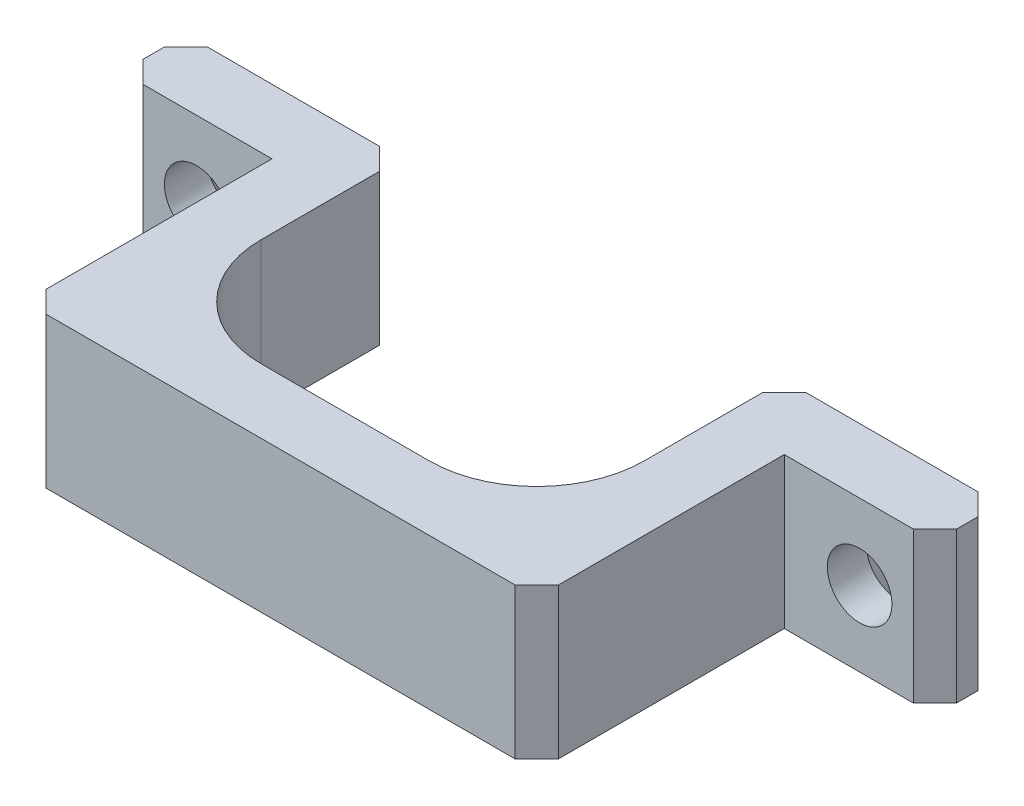
ISO-10303-21;
HEADER;
FILE_DESCRIPTION(('STEP AP214'),'2;1');
FILE_NAME('part.step','',(''),(''),'','','');
FILE_SCHEMA(('AUTOMOTIVE_DESIGN { 1 0 10303 214 1 1 1 1 }'));
ENDSEC;
DATA;
#1=APPLICATION_CONTEXT('core data for automotive mechanical design processes');
#2=APPLICATION_PROTOCOL_DEFINITION('international standard','automotive_design',2000,#1);
#3=PRODUCT_CONTEXT('',#1,'mechanical');
#4=PRODUCT('Part','Part','',(#3));
#5=PRODUCT_RELATED_PRODUCT_CATEGORY('part','',(#4));
#6=PRODUCT_DEFINITION_FORMATION('','',#4);
#7=PRODUCT_DEFINITION_CONTEXT('part definition',#1,'design');
#8=PRODUCT_DEFINITION('design','',#6,#7);
#9=PRODUCT_DEFINITION_SHAPE('','',#8);
#10=(LENGTH_UNIT() NAMED_UNIT(*) SI_UNIT(.MILLI.,.METRE.));
#11=(NAMED_UNIT(*) PLANE_ANGLE_UNIT() SI_UNIT($,.RADIAN.));
#12=(NAMED_UNIT(*) SI_UNIT($,.STERADIAN.) SOLID_ANGLE_UNIT());
#13=UNCERTAINTY_MEASURE_WITH_UNIT(LENGTH_MEASURE(1.E-05),#10,'distance_accuracy_value','');
#14=(GEOMETRIC_REPRESENTATION_CONTEXT(3) GLOBAL_UNCERTAINTY_ASSIGNED_CONTEXT((#13)) GLOBAL_UNIT_ASSIGNED_CONTEXT((#10,
#11,#12)) REPRESENTATION_CONTEXT('',''));
#15=CARTESIAN_POINT('',(0.,0.,0.));
#16=DIRECTION('',(0.,0.,1.));
#17=DIRECTION('',(1.,0.,0.));
#18=AXIS2_PLACEMENT_3D('',#15,#16,#17);
#19=CARTESIAN_POINT('',(-15.4,-7.,3.));
#20=DIRECTION('',(0.,0.,-1.));
#21=DIRECTION('',(-1.,0.,0.));
#22=AXIS2_PLACEMENT_3D('',#19,#20,#21);
#23=PLANE('',#22);
#24=CARTESIAN_POINT('',(15.4,-3.52108829518854,3.));
#25=DIRECTION('',(0.,0.,-1.));
#26=DIRECTION('',(-1.,0.,0.));
#27=AXIS2_PLACEMENT_3D('',#24,#25,#26);
#28=CIRCLE('',#27,1.49999999999999);
#29=CARTESIAN_POINT('',(13.9,-3.52108829518854,3.));
#30=VERTEX_POINT('',#29);
#31=EDGE_CURVE('E666',#30,#30,#28,.T.);
#32=ORIENTED_EDGE('',*,*,#31,.T.);
#33=EDGE_LOOP('',(#32));
#34=FACE_BOUND('',#33,.T.);
#35=DIRECTION('',(1.,0.,0.));
#36=VECTOR('',#35,1.);
#37=CARTESIAN_POINT('',(0.,-7.,3.));
#38=LINE('',#37,#36);
#39=CARTESIAN_POINT('',(11.9,-7.,3.));
#40=VERTEX_POINT('',#39);
#41=CARTESIAN_POINT('',(17.9,-7.,3.));
#42=VERTEX_POINT('',#41);
#43=EDGE_CURVE('E231',#40,#42,#38,.T.);
#44=ORIENTED_EDGE('',*,*,#43,.T.);
#45=DIRECTION('',(0.,1.,0.));
#46=VECTOR('',#45,1.);
#47=CARTESIAN_POINT('',(17.9,-7.,3.));
#48=LINE('',#47,#46);
#49=CARTESIAN_POINT('',(17.9,0.,3.));
#50=VERTEX_POINT('',#49);
#51=EDGE_CURVE('E251',#42,#50,#48,.T.);
#52=ORIENTED_EDGE('',*,*,#51,.T.);
#53=DIRECTION('',(-1.,0.,0.));
#54=VECTOR('',#53,1.);
#55=CARTESIAN_POINT('',(-15.4,0.,3.));
#56=LINE('',#55,#54);
#57=CARTESIAN_POINT('',(11.9,0.,3.));
#58=VERTEX_POINT('',#57);
#59=EDGE_CURVE('E360',#50,#58,#56,.T.);
#60=ORIENTED_EDGE('',*,*,#59,.T.);
#61=DIRECTION('',(0.,1.,0.));
#62=VECTOR('',#61,1.);
#63=CARTESIAN_POINT('',(11.9,0.,3.));
#64=LINE('',#63,#62);
#65=EDGE_CURVE('E594',#40,#58,#64,.T.);
#66=ORIENTED_EDGE('',*,*,#65,.F.);
#67=EDGE_LOOP('',(#44,#52,#60,#66));
#68=FACE_BOUND('',#67,.T.);
#69=ADVANCED_FACE('F61',(#34,#68),#23,.F.);
#70=CARTESIAN_POINT('',(-15.4,-3.52108829518854,3.));
#71=DIRECTION('',(0.,0.,1.));
#72=DIRECTION('',(1.,0.,0.));
#73=AXIS2_PLACEMENT_3D('',#70,#71,#72);
#74=CIRCLE('',#73,1.49999999999999);
#75=CARTESIAN_POINT('',(-13.9,-3.52108829518854,3.));
#76=VERTEX_POINT('',#75);
#77=EDGE_CURVE('E673',#76,#76,#74,.T.);
#78=ORIENTED_EDGE('',*,*,#77,.F.);
#79=EDGE_LOOP('',(#78));
#80=FACE_BOUND('',#79,.T.);
#81=CARTESIAN_POINT('',(-17.9,-7.,3.));
#82=VERTEX_POINT('',#81);
#83=CARTESIAN_POINT('',(-11.9,-7.,3.));
#84=VERTEX_POINT('',#83);
#85=EDGE_CURVE('E220',#82,#84,#38,.T.);
#86=ORIENTED_EDGE('',*,*,#85,.T.);
#87=DIRECTION('',(0.,-1.,0.));
#88=VECTOR('',#87,1.);
#89=CARTESIAN_POINT('',(-11.9,-7.,3.));
#90=LINE('',#89,#88);
#91=CARTESIAN_POINT('',(-11.9,0.,3.));
#92=VERTEX_POINT('',#91);
#93=EDGE_CURVE('E687',#92,#84,#90,.T.);
#94=ORIENTED_EDGE('',*,*,#93,.F.);
#95=CARTESIAN_POINT('',(-17.9,0.,3.));
#96=VERTEX_POINT('',#95);
#97=EDGE_CURVE('E248',#92,#96,#56,.T.);
#98=ORIENTED_EDGE('',*,*,#97,.T.);
#99=DIRECTION('',(0.,-1.,0.));
#100=VECTOR('',#99,1.);
#101=CARTESIAN_POINT('',(-17.9,-7.,3.));
#102=LINE('',#101,#100);
#103=EDGE_CURVE('E238',#96,#82,#102,.T.);
#104=ORIENTED_EDGE('',*,*,#103,.T.);
#105=EDGE_LOOP('',(#86,#94,#98,#104));
#106=FACE_BOUND('',#105,.T.);
#107=ADVANCED_FACE('F246',(#80,#106),#23,.F.);
#108=CARTESIAN_POINT('',(13.9,-7.,0.));
#109=DIRECTION('',(0.,0.,1.));
#110=DIRECTION('',(1.,0.,0.));
#111=AXIS2_PLACEMENT_3D('',#108,#109,#110);
#112=PLANE('',#111);
#113=DIRECTION('',(1.,0.,0.));
#114=VECTOR('',#113,1.);
#115=CARTESIAN_POINT('',(13.9,-7.,0.));
#116=LINE('',#115,#114);
#117=CARTESIAN_POINT('',(-17.9,-7.,0.));
#118=VERTEX_POINT('',#117);
#119=CARTESIAN_POINT('',(-9.9,-7.,0.));
#120=VERTEX_POINT('',#119);
#121=EDGE_CURVE('E243',#118,#120,#116,.T.);
#122=ORIENTED_EDGE('',*,*,#121,.F.);
#123=DIRECTION('',(0.,1.,0.));
#124=VECTOR('',#123,1.);
#125=CARTESIAN_POINT('',(-17.9,0.,0.));
#126=LINE('',#125,#124);
#127=CARTESIAN_POINT('',(-17.9,-4.51885450189423,0.));
#128=VERTEX_POINT('',#127);
#129=EDGE_CURVE('E259',#118,#128,#126,.T.);
#130=ORIENTED_EDGE('',*,*,#129,.T.);
#131=CARTESIAN_POINT('',(-15.4,-3.52108829518854,0.));
#132=DIRECTION('',(0.,0.,1.));
#133=DIRECTION('',(1.,0.,0.));
#134=AXIS2_PLACEMENT_3D('',#131,#132,#133);
#135=CIRCLE('',#134,2.69175359259421);
#136=CARTESIAN_POINT('',(-17.9,-2.52332208848286,0.));
#137=VERTEX_POINT('',#136);
#138=EDGE_CURVE('E476',#128,#137,#135,.T.);
#139=ORIENTED_EDGE('',*,*,#138,.T.);
#140=CARTESIAN_POINT('',(-17.9,0.,0.));
#141=VERTEX_POINT('',#140);
#142=EDGE_CURVE('E430',#137,#141,#126,.T.);
#143=ORIENTED_EDGE('',*,*,#142,.T.);
#144=DIRECTION('',(1.,0.,0.));
#145=VECTOR('',#144,1.);
#146=CARTESIAN_POINT('',(13.9,0.,0.));
#147=LINE('',#146,#145);
#148=CARTESIAN_POINT('',(-9.9,0.,0.));
#149=VERTEX_POINT('',#148);
#150=EDGE_CURVE('E351',#141,#149,#147,.T.);
#151=ORIENTED_EDGE('',*,*,#150,.T.);
#152=DIRECTION('',(0.,-1.,0.));
#153=VECTOR('',#152,1.);
#154=CARTESIAN_POINT('',(-9.9,-7.,0.));
#155=LINE('',#154,#153);
#156=EDGE_CURVE('E573',#149,#120,#155,.T.);
#157=ORIENTED_EDGE('',*,*,#156,.T.);
#158=EDGE_LOOP('',(#122,#130,#139,#143,#151,#157));
#159=FACE_BOUND('',#158,.T.);
#160=ADVANCED_FACE('F530',(#159),#112,.F.);
#161=CARTESIAN_POINT('',(9.9,-7.,0.));
#162=VERTEX_POINT('',#161);
#163=CARTESIAN_POINT('',(17.9,-7.,0.));
#164=VERTEX_POINT('',#163);
#165=EDGE_CURVE('E578',#162,#164,#116,.T.);
#166=ORIENTED_EDGE('',*,*,#165,.F.);
#167=DIRECTION('',(0.,1.,0.));
#168=VECTOR('',#167,1.);
#169=CARTESIAN_POINT('',(9.9,-7.,0.));
#170=LINE('',#169,#168);
#171=CARTESIAN_POINT('',(9.9,0.,0.));
#172=VERTEX_POINT('',#171);
#173=EDGE_CURVE('E636',#162,#172,#170,.T.);
#174=ORIENTED_EDGE('',*,*,#173,.T.);
#175=CARTESIAN_POINT('',(17.9,0.,0.));
#176=VERTEX_POINT('',#175);
#177=EDGE_CURVE('E357',#172,#176,#147,.T.);
#178=ORIENTED_EDGE('',*,*,#177,.T.);
#179=DIRECTION('',(0.,-1.,0.));
#180=VECTOR('',#179,1.);
#181=CARTESIAN_POINT('',(17.9,-7.,0.));
#182=LINE('',#181,#180);
#183=CARTESIAN_POINT('',(17.9,-3.52108829518854,0.));
#184=VERTEX_POINT('',#183);
#185=EDGE_CURVE('E366',#176,#184,#182,.T.);
#186=ORIENTED_EDGE('',*,*,#185,.T.);
#187=CARTESIAN_POINT('',(15.4,-3.52108829518854,0.));
#188=DIRECTION('',(0.,0.,1.));
#189=DIRECTION('',(1.,0.,0.));
#190=AXIS2_PLACEMENT_3D('',#187,#188,#189);
#191=CIRCLE('',#190,2.5);
#192=EDGE_CURVE('E472',#184,#184,#191,.T.);
#193=ORIENTED_EDGE('',*,*,#192,.T.);
#194=EDGE_CURVE('E365',#184,#164,#182,.T.);
#195=ORIENTED_EDGE('',*,*,#194,.T.);
#196=EDGE_LOOP('',(#166,#174,#178,#186,#193,#195));
#197=FACE_BOUND('',#196,.T.);
#198=ADVANCED_FACE('F539',(#197),#112,.F.);
#199=CARTESIAN_POINT('',(18.9,-7.,1.));
#200=DIRECTION('',(0.707106781186547,0.,-0.707106781186548));
#201=DIRECTION('',(0.,-1.,0.));
#202=AXIS2_PLACEMENT_3D('',#199,#200,#201);
#203=PLANE('',#202);
#204=DIRECTION('',(0.,-1.,0.));
#205=VECTOR('',#204,1.);
#206=CARTESIAN_POINT('',(18.9,-7.,1.));
#207=LINE('',#206,#205);
#208=CARTESIAN_POINT('',(18.9,0.,1.));
#209=VERTEX_POINT('',#208);
#210=CARTESIAN_POINT('',(18.9,-7.,1.));
#211=VERTEX_POINT('',#210);
#212=EDGE_CURVE('E464',#209,#211,#207,.T.);
#213=ORIENTED_EDGE('',*,*,#212,.T.);
#214=DIRECTION('',(-0.707106781186548,0.,-0.707106781186547));
#215=VECTOR('',#214,1.);
#216=CARTESIAN_POINT('',(18.9,-7.,1.));
#217=LINE('',#216,#215);
#218=EDGE_CURVE('E77',#211,#164,#217,.T.);
#219=ORIENTED_EDGE('',*,*,#218,.T.);
#220=ORIENTED_EDGE('',*,*,#194,.F.);
#221=ORIENTED_EDGE('',*,*,#185,.F.);
#222=DIRECTION('',(-0.707106781186548,0.,-0.707106781186547));
#223=VECTOR('',#222,1.);
#224=CARTESIAN_POINT('',(18.9,0.,1.));
#225=LINE('',#224,#223);
#226=EDGE_CURVE('E431',#209,#176,#225,.T.);
#227=ORIENTED_EDGE('',*,*,#226,.F.);
#228=EDGE_LOOP('',(#213,#219,#220,#221,#227));
#229=FACE_BOUND('',#228,.T.);
#230=ADVANCED_FACE('F542',(#229),#203,.T.);
#231=CARTESIAN_POINT('',(17.9,-7.,3.));
#232=DIRECTION('',(-0.707106781186547,0.,-0.707106781186548));
#233=DIRECTION('',(0.,1.,0.));
#234=AXIS2_PLACEMENT_3D('',#231,#232,#233);
#235=PLANE('',#234);
#236=ORIENTED_EDGE('',*,*,#51,.F.);
#237=DIRECTION('',(-0.707106781186548,0.,0.707106781186547));
#238=VECTOR('',#237,1.);
#239=CARTESIAN_POINT('',(17.9,-7.,3.));
#240=LINE('',#239,#238);
#241=CARTESIAN_POINT('',(18.9,-7.,2.00000000000001));
#242=VERTEX_POINT('',#241);
#243=EDGE_CURVE('E242',#42,#242,#240,.F.);
#244=ORIENTED_EDGE('',*,*,#243,.T.);
#245=DIRECTION('',(0.,-1.,0.));
#246=VECTOR('',#245,1.);
#247=CARTESIAN_POINT('',(18.9,-7.,2.));
#248=LINE('',#247,#246);
#249=CARTESIAN_POINT('',(18.9,0.,2.));
#250=VERTEX_POINT('',#249);
#251=EDGE_CURVE('E459',#242,#250,#248,.F.);
#252=ORIENTED_EDGE('',*,*,#251,.T.);
#253=DIRECTION('',(-0.707106781186548,0.,0.707106781186547));
#254=VECTOR('',#253,1.);
#255=CARTESIAN_POINT('',(17.9,0.,3.));
#256=LINE('',#255,#254);
#257=EDGE_CURVE('E435',#50,#250,#256,.F.);
#258=ORIENTED_EDGE('',*,*,#257,.F.);
#259=EDGE_LOOP('',(#236,#244,#252,#258));
#260=FACE_BOUND('',#259,.T.);
#261=ADVANCED_FACE('F548',(#260),#235,.F.);
#262=CARTESIAN_POINT('',(-18.9,-7.,2.));
#263=DIRECTION('',(-0.707106781186546,0.,0.707106781186549));
#264=DIRECTION('',(0.,-1.,0.));
#265=AXIS2_PLACEMENT_3D('',#262,#263,#264);
#266=PLANE('',#265);
#267=DIRECTION('',(0.,-1.,0.));
#268=VECTOR('',#267,1.);
#269=CARTESIAN_POINT('',(-18.9,-7.,2.));
#270=LINE('',#269,#268);
#271=CARTESIAN_POINT('',(-18.9,0.,2.));
#272=VERTEX_POINT('',#271);
#273=CARTESIAN_POINT('',(-18.9,-7.,2.));
#274=VERTEX_POINT('',#273);
#275=EDGE_CURVE('E240',#272,#274,#270,.T.);
#276=ORIENTED_EDGE('',*,*,#275,.T.);
#277=DIRECTION('',(0.707106781186549,0.,0.707106781186546));
#278=VECTOR('',#277,1.);
#279=CARTESIAN_POINT('',(-18.9,-7.,2.));
#280=LINE('',#279,#278);
#281=EDGE_CURVE('E84',#274,#82,#280,.T.);
#282=ORIENTED_EDGE('',*,*,#281,.T.);
#283=ORIENTED_EDGE('',*,*,#103,.F.);
#284=DIRECTION('',(0.707106781186549,0.,0.707106781186546));
#285=VECTOR('',#284,1.);
#286=CARTESIAN_POINT('',(-18.9,0.,2.));
#287=LINE('',#286,#285);
#288=EDGE_CURVE('E438',#272,#96,#287,.T.);
#289=ORIENTED_EDGE('',*,*,#288,.F.);
#290=EDGE_LOOP('',(#276,#282,#283,#289));
#291=FACE_BOUND('',#290,.T.);
#292=ADVANCED_FACE('F236',(#291),#266,.T.);
#293=CARTESIAN_POINT('',(-17.9,-7.,0.));
#294=DIRECTION('',(-0.707106781186547,0.,-0.707106781186548));
#295=DIRECTION('',(0.,-1.,0.));
#296=AXIS2_PLACEMENT_3D('',#293,#294,#295);
#297=PLANE('',#296);
#298=ORIENTED_EDGE('',*,*,#129,.F.);
#299=DIRECTION('',(-0.707106781186548,0.,0.707106781186547));
#300=VECTOR('',#299,1.);
#301=CARTESIAN_POINT('',(-17.9,-7.,0.));
#302=LINE('',#301,#300);
#303=CARTESIAN_POINT('',(-18.9,-7.,0.999999999999992));
#304=VERTEX_POINT('',#303);
#305=EDGE_CURVE('E568',#118,#304,#302,.T.);
#306=ORIENTED_EDGE('',*,*,#305,.T.);
#307=DIRECTION('',(0.,1.,0.));
#308=VECTOR('',#307,1.);
#309=CARTESIAN_POINT('',(-18.9,-7.,0.999999999999992));
#310=LINE('',#309,#308);
#311=CARTESIAN_POINT('',(-18.9,0.,0.999999999999992));
#312=VERTEX_POINT('',#311);
#313=EDGE_CURVE('E456',#304,#312,#310,.T.);
#314=ORIENTED_EDGE('',*,*,#313,.T.);
#315=DIRECTION('',(-0.707106781186548,0.,0.707106781186547));
#316=VECTOR('',#315,1.);
#317=CARTESIAN_POINT('',(-17.9,0.,0.));
#318=LINE('',#317,#316);
#319=EDGE_CURVE('E371',#141,#312,#318,.T.);
#320=ORIENTED_EDGE('',*,*,#319,.F.);
#321=ORIENTED_EDGE('',*,*,#142,.F.);
#322=CARTESIAN_POINT('',(-17.9,-2.52332208848286,0.));
#323=CARTESIAN_POINT('',(-17.9101389096454,-2.58131880890307,0.0101389096453853));
#324=CARTESIAN_POINT('',(-17.9194527261863,-2.6395990363849,0.0194527261863021));
#325=CARTESIAN_POINT('',(-17.9363654759192,-2.75666181262716,0.0363654759192318));
#326=CARTESIAN_POINT('',(-17.9439642024387,-2.81544442104088,0.0439642024386729));
#327=CARTESIAN_POINT('',(-17.9640916375543,-2.99246582745685,0.064091637554281));
#328=CARTESIAN_POINT('',(-17.9739449596483,-3.11134060912433,0.0739449596483276));
#329=CARTESIAN_POINT('',(-17.9860297052182,-3.34737295212778,0.0860297052182067));
#330=CARTESIAN_POINT('',(-17.9884149231967,-3.46451501508551,0.0884149231967267));
#331=CARTESIAN_POINT('',(-17.9859178784112,-3.69857870371176,0.0859178784111792));
#332=CARTESIAN_POINT('',(-17.9810402010261,-3.81550042184029,0.0810402010261443));
#333=CARTESIAN_POINT('',(-17.965494598829,-4.03033558949788,0.0654945988290064));
#334=CARTESIAN_POINT('',(-17.9558357107894,-4.12839952170905,0.0558357107893599));
#335=CARTESIAN_POINT('',(-17.931588665761,-4.3242105462924,0.0315886657610437));
#336=CARTESIAN_POINT('',(-17.9169571093415,-4.42194692329425,0.0169571093415447));
#337=CARTESIAN_POINT('',(-17.9,-4.51885450189423,0.));
#338=B_SPLINE_CURVE_WITH_KNOTS('',3,(#322,#323,#324,#325,#326,#327,#328,#329,#330,#331,#332,
#333,#334,#335,#336,#337),.UNSPECIFIED.,.F.,.F.,(4,2,2,2,2,2,2,4),(0.,0.179205192813009,
0.358431968777682,0.717001407619334,1.06813636774897,1.41904973521207,1.7158425940141,
2.01529525423668),.UNSPECIFIED.);
#339=EDGE_CURVE('E480',#137,#128,#338,.T.);
#340=ORIENTED_EDGE('',*,*,#339,.T.);
#341=EDGE_LOOP('',(#298,#306,#314,#320,#321,#340));
#342=FACE_BOUND('',#341,.T.);
#343=ADVANCED_FACE('F493',(#342),#297,.T.);
#344=CARTESIAN_POINT('',(18.9,-7.,1.));
#345=DIRECTION('',(1.,0.,0.));
#346=DIRECTION('',(0.,1.,0.));
#347=AXIS2_PLACEMENT_3D('',#344,#345,#346);
#348=PLANE('',#347);
#349=ORIENTED_EDGE('',*,*,#251,.F.);
#350=DIRECTION('',(0.,0.,1.));
#351=VECTOR('',#350,1.);
#352=CARTESIAN_POINT('',(18.9,-7.,-7.));
#353=LINE('',#352,#351);
#354=EDGE_CURVE('E230',#211,#242,#353,.T.);
#355=ORIENTED_EDGE('',*,*,#354,.F.);
#356=ORIENTED_EDGE('',*,*,#212,.F.);
#357=DIRECTION('',(0.,0.,-1.));
#358=VECTOR('',#357,1.);
#359=CARTESIAN_POINT('',(18.9,0.,1.));
#360=LINE('',#359,#358);
#361=EDGE_CURVE('E458',#250,#209,#360,.T.);
#362=ORIENTED_EDGE('',*,*,#361,.F.);
#363=EDGE_LOOP('',(#349,#355,#356,#362));
#364=FACE_BOUND('',#363,.T.);
#365=ADVANCED_FACE('F561',(#364),#348,.T.);
#366=CARTESIAN_POINT('',(-18.9,-7.,2.));
#367=DIRECTION('',(1.,0.,0.));
#368=DIRECTION('',(0.,-1.,0.));
#369=AXIS2_PLACEMENT_3D('',#366,#367,#368);
#370=PLANE('',#369);
#371=ORIENTED_EDGE('',*,*,#313,.F.);
#372=DIRECTION('',(0.,0.,-1.));
#373=VECTOR('',#372,1.);
#374=CARTESIAN_POINT('',(-18.9,-7.,2.));
#375=LINE('',#374,#373);
#376=EDGE_CURVE('E12',#304,#274,#375,.F.);
#377=ORIENTED_EDGE('',*,*,#376,.T.);
#378=ORIENTED_EDGE('',*,*,#275,.F.);
#379=DIRECTION('',(0.,0.,-1.));
#380=VECTOR('',#379,1.);
#381=CARTESIAN_POINT('',(-18.9,0.,2.));
#382=LINE('',#381,#380);
#383=EDGE_CURVE('E450',#312,#272,#382,.F.);
#384=ORIENTED_EDGE('',*,*,#383,.F.);
#385=EDGE_LOOP('',(#371,#377,#378,#384));
#386=FACE_BOUND('',#385,.T.);
#387=ADVANCED_FACE('F455',(#386),#370,.F.);
#388=CARTESIAN_POINT('',(0.,0.,7.25));
#389=DIRECTION('',(0.,-1.,0.));
#390=DIRECTION('',(1.,0.,0.));
#391=AXIS2_PLACEMENT_3D('',#388,#389,#390);
#392=PLANE('',#391);
#393=ORIENTED_EDGE('',*,*,#257,.T.);
#394=ORIENTED_EDGE('',*,*,#361,.T.);
#395=ORIENTED_EDGE('',*,*,#226,.T.);
#396=ORIENTED_EDGE('',*,*,#177,.F.);
#397=DIRECTION('',(0.707106781186547,0.,-0.707106781186549));
#398=VECTOR('',#397,1.);
#399=CARTESIAN_POINT('',(9.9,0.,0.));
#400=LINE('',#399,#398);
#401=CARTESIAN_POINT('',(8.9,0.,1.00000000000001));
#402=VERTEX_POINT('',#401);
#403=EDGE_CURVE('E649',#172,#402,#400,.F.);
#404=ORIENTED_EDGE('',*,*,#403,.T.);
#405=DIRECTION('',(0.,0.,-1.));
#406=VECTOR('',#405,1.);
#407=CARTESIAN_POINT('',(8.9,0.,11.5));
#408=LINE('',#407,#406);
#409=CARTESIAN_POINT('',(8.9,0.,6.5));
#410=VERTEX_POINT('',#409);
#411=EDGE_CURVE('E671',#410,#402,#408,.T.);
#412=ORIENTED_EDGE('',*,*,#411,.F.);
#413=CARTESIAN_POINT('',(3.9,0.,6.5));
#414=DIRECTION('',(0.,-1.,0.));
#415=DIRECTION('',(0.,0.,-1.));
#416=AXIS2_PLACEMENT_3D('',#413,#414,#415);
#417=CIRCLE('',#416,5.);
#418=CARTESIAN_POINT('',(3.9,0.,11.5));
#419=VERTEX_POINT('',#418);
#420=EDGE_CURVE('E1132',#410,#419,#417,.T.);
#421=ORIENTED_EDGE('',*,*,#420,.T.);
#422=DIRECTION('',(1.,0.,0.));
#423=VECTOR('',#422,1.);
#424=CARTESIAN_POINT('',(-8.9,0.,11.5));
#425=LINE('',#424,#423);
#426=CARTESIAN_POINT('',(-3.9,0.,11.5));
#427=VERTEX_POINT('',#426);
#428=EDGE_CURVE('E665',#427,#419,#425,.T.);
#429=ORIENTED_EDGE('',*,*,#428,.F.);
#430=CARTESIAN_POINT('',(-3.9,0.,6.5));
#431=DIRECTION('',(0.,-1.,0.));
#432=DIRECTION('',(0.,0.,-1.));
#433=AXIS2_PLACEMENT_3D('',#430,#431,#432);
#434=CIRCLE('',#433,5.);
#435=CARTESIAN_POINT('',(-8.9,0.,6.5));
#436=VERTEX_POINT('',#435);
#437=EDGE_CURVE('E663',#427,#436,#434,.T.);
#438=ORIENTED_EDGE('',*,*,#437,.T.);
#439=DIRECTION('',(0.,0.,1.));
#440=VECTOR('',#439,1.);
#441=CARTESIAN_POINT('',(-8.9,0.,0.));
#442=LINE('',#441,#440);
#443=CARTESIAN_POINT('',(-8.9,0.,0.999999999999998));
#444=VERTEX_POINT('',#443);
#445=EDGE_CURVE('E659',#444,#436,#442,.T.);
#446=ORIENTED_EDGE('',*,*,#445,.F.);
#447=DIRECTION('',(0.707106781186551,0.,0.707106781186544));
#448=VECTOR('',#447,1.);
#449=CARTESIAN_POINT('',(-8.9,0.,0.999999999999998));
#450=LINE('',#449,#448);
#451=EDGE_CURVE('E640',#444,#149,#450,.F.);
#452=ORIENTED_EDGE('',*,*,#451,.T.);
#453=ORIENTED_EDGE('',*,*,#150,.F.);
#454=ORIENTED_EDGE('',*,*,#319,.T.);
#455=ORIENTED_EDGE('',*,*,#383,.T.);
#456=ORIENTED_EDGE('',*,*,#288,.T.);
#457=ORIENTED_EDGE('',*,*,#97,.F.);
#458=DIRECTION('',(0.,0.,-1.));
#459=VECTOR('',#458,1.);
#460=CARTESIAN_POINT('',(-11.9,0.,14.5));
#461=LINE('',#460,#459);
#462=CARTESIAN_POINT('',(-11.9,0.,13.5));
#463=VERTEX_POINT('',#462);
#464=EDGE_CURVE('E699',#463,#92,#461,.T.);
#465=ORIENTED_EDGE('',*,*,#464,.F.);
#466=DIRECTION('',(-0.707106781186546,0.,-0.707106781186549));
#467=VECTOR('',#466,1.);
#468=CARTESIAN_POINT('',(-10.9,0.,14.5));
#469=LINE('',#468,#467);
#470=CARTESIAN_POINT('',(-10.9,0.,14.5));
#471=VERTEX_POINT('',#470);
#472=EDGE_CURVE('E646',#463,#471,#469,.F.);
#473=ORIENTED_EDGE('',*,*,#472,.T.);
#474=DIRECTION('',(-1.,0.,0.));
#475=VECTOR('',#474,1.);
#476=CARTESIAN_POINT('',(-11.9,0.,14.5));
#477=LINE('',#476,#475);
#478=CARTESIAN_POINT('',(10.9,0.,14.5));
#479=VERTEX_POINT('',#478);
#480=EDGE_CURVE('E682',#479,#471,#477,.T.);
#481=ORIENTED_EDGE('',*,*,#480,.F.);
#482=DIRECTION('',(-0.707106781186546,0.,0.707106781186549));
#483=VECTOR('',#482,1.);
#484=CARTESIAN_POINT('',(10.9,0.,14.5));
#485=LINE('',#484,#483);
#486=CARTESIAN_POINT('',(11.9,0.,13.5));
#487=VERTEX_POINT('',#486);
#488=EDGE_CURVE('E643',#479,#487,#485,.F.);
#489=ORIENTED_EDGE('',*,*,#488,.T.);
#490=DIRECTION('',(0.,0.,-1.));
#491=VECTOR('',#490,1.);
#492=CARTESIAN_POINT('',(11.9,0.,14.5));
#493=LINE('',#492,#491);
#494=EDGE_CURVE('E358',#487,#58,#493,.T.);
#495=ORIENTED_EDGE('',*,*,#494,.T.);
#496=ORIENTED_EDGE('',*,*,#59,.F.);
#497=EDGE_LOOP('',(#393,#394,#395,#396,#404,#412,#421,#429,#438,#446,#452,#453,#454,#455,#456,
#457,#465,#473,#481,#489,#495,#496));
#498=FACE_BOUND('',#497,.T.);
#499=ADVANCED_FACE('F449',(#498),#392,.F.);
#500=CARTESIAN_POINT('',(11.9,0.,14.5));
#501=DIRECTION('',(-1.,0.,0.));
#502=DIRECTION('',(0.,0.,1.));
#503=AXIS2_PLACEMENT_3D('',#500,#501,#502);
#504=PLANE('',#503);
#505=ORIENTED_EDGE('',*,*,#494,.F.);
#506=DIRECTION('',(0.,-1.,0.));
#507=VECTOR('',#506,1.);
#508=CARTESIAN_POINT('',(11.9,0.,13.5));
#509=LINE('',#508,#507);
#510=CARTESIAN_POINT('',(11.9,-7.,13.5));
#511=VERTEX_POINT('',#510);
#512=EDGE_CURVE('E623',#487,#511,#509,.T.);
#513=ORIENTED_EDGE('',*,*,#512,.T.);
#514=DIRECTION('',(0.,0.,-1.));
#515=VECTOR('',#514,1.);
#516=CARTESIAN_POINT('',(11.9,-7.,14.5));
#517=LINE('',#516,#515);
#518=EDGE_CURVE('E691',#511,#40,#517,.T.);
#519=ORIENTED_EDGE('',*,*,#518,.T.);
#520=ORIENTED_EDGE('',*,*,#65,.T.);
#521=EDGE_LOOP('',(#505,#513,#519,#520));
#522=FACE_BOUND('',#521,.T.);
#523=ADVANCED_FACE('F743',(#522),#504,.F.);
#524=CARTESIAN_POINT('',(-11.9,-7.,14.5));
#525=DIRECTION('',(1.,0.,0.));
#526=DIRECTION('',(0.,0.,-1.));
#527=AXIS2_PLACEMENT_3D('',#524,#525,#526);
#528=PLANE('',#527);
#529=DIRECTION('',(0.,0.,-1.));
#530=VECTOR('',#529,1.);
#531=CARTESIAN_POINT('',(-11.9,-7.,14.5));
#532=LINE('',#531,#530);
#533=CARTESIAN_POINT('',(-11.9,-7.,13.5));
#534=VERTEX_POINT('',#533);
#535=EDGE_CURVE('E224',#534,#84,#532,.T.);
#536=ORIENTED_EDGE('',*,*,#535,.F.);
#537=DIRECTION('',(0.,1.,0.));
#538=VECTOR('',#537,1.);
#539=CARTESIAN_POINT('',(-11.9,-7.,13.5));
#540=LINE('',#539,#538);
#541=EDGE_CURVE('E614',#534,#463,#540,.T.);
#542=ORIENTED_EDGE('',*,*,#541,.T.);
#543=ORIENTED_EDGE('',*,*,#464,.T.);
#544=ORIENTED_EDGE('',*,*,#93,.T.);
#545=EDGE_LOOP('',(#536,#542,#543,#544));
#546=FACE_BOUND('',#545,.T.);
#547=ADVANCED_FACE('F759',(#546),#528,.F.);
#548=CARTESIAN_POINT('',(11.9,-7.,14.5));
#549=DIRECTION('',(0.,1.,0.));
#550=DIRECTION('',(0.,0.,1.));
#551=AXIS2_PLACEMENT_3D('',#548,#549,#550);
#552=PLANE('',#551);
#553=ORIENTED_EDGE('',*,*,#518,.F.);
#554=DIRECTION('',(0.707106781186546,0.,-0.707106781186549));
#555=VECTOR('',#554,1.);
#556=CARTESIAN_POINT('',(10.9,-7.,14.5));
#557=LINE('',#556,#555);
#558=CARTESIAN_POINT('',(10.9,-7.,14.5));
#559=VERTEX_POINT('',#558);
#560=EDGE_CURVE('E617',#511,#559,#557,.F.);
#561=ORIENTED_EDGE('',*,*,#560,.T.);
#562=DIRECTION('',(1.,0.,0.));
#563=VECTOR('',#562,1.);
#564=CARTESIAN_POINT('',(11.9,-7.,14.5));
#565=LINE('',#564,#563);
#566=CARTESIAN_POINT('',(-10.9,-7.,14.5));
#567=VERTEX_POINT('',#566);
#568=EDGE_CURVE('E686',#567,#559,#565,.T.);
#569=ORIENTED_EDGE('',*,*,#568,.F.);
#570=DIRECTION('',(0.707106781186546,0.,0.707106781186549));
#571=VECTOR('',#570,1.);
#572=CARTESIAN_POINT('',(-10.9,-7.,14.5));
#573=LINE('',#572,#571);
#574=EDGE_CURVE('E620',#567,#534,#573,.F.);
#575=ORIENTED_EDGE('',*,*,#574,.T.);
#576=ORIENTED_EDGE('',*,*,#535,.T.);
#577=ORIENTED_EDGE('',*,*,#85,.F.);
#578=ORIENTED_EDGE('',*,*,#281,.F.);
#579=ORIENTED_EDGE('',*,*,#376,.F.);
#580=ORIENTED_EDGE('',*,*,#305,.F.);
#581=ORIENTED_EDGE('',*,*,#121,.T.);
#582=DIRECTION('',(-0.707106781186551,0.,-0.707106781186544));
#583=VECTOR('',#582,1.);
#584=CARTESIAN_POINT('',(-8.9,-7.,0.999999999999998));
#585=LINE('',#584,#583);
#586=CARTESIAN_POINT('',(-8.9,-7.,0.999999999999997));
#587=VERTEX_POINT('',#586);
#588=EDGE_CURVE('E605',#120,#587,#585,.F.);
#589=ORIENTED_EDGE('',*,*,#588,.T.);
#590=DIRECTION('',(0.,0.,1.));
#591=VECTOR('',#590,1.);
#592=CARTESIAN_POINT('',(-8.9,-7.,14.5));
#593=LINE('',#592,#591);
#594=CARTESIAN_POINT('',(-8.9,-7.,6.5));
#595=VERTEX_POINT('',#594);
#596=EDGE_CURVE('E250',#587,#595,#593,.T.);
#597=ORIENTED_EDGE('',*,*,#596,.T.);
#598=CARTESIAN_POINT('',(-3.9,-7.,6.5));
#599=DIRECTION('',(0.,1.,0.));
#600=DIRECTION('',(0.,0.,1.));
#601=AXIS2_PLACEMENT_3D('',#598,#599,#600);
#602=CIRCLE('',#601,5.);
#603=CARTESIAN_POINT('',(-3.9,-7.,11.5));
#604=VERTEX_POINT('',#603);
#605=EDGE_CURVE('E70',#595,#604,#602,.T.);
#606=ORIENTED_EDGE('',*,*,#605,.T.);
#607=DIRECTION('',(1.,0.,0.));
#608=VECTOR('',#607,1.);
#609=CARTESIAN_POINT('',(-8.9,-7.,11.5));
#610=LINE('',#609,#608);
#611=CARTESIAN_POINT('',(3.9,-7.,11.5));
#612=VERTEX_POINT('',#611);
#613=EDGE_CURVE('E681',#604,#612,#610,.T.);
#614=ORIENTED_EDGE('',*,*,#613,.T.);
#615=CARTESIAN_POINT('',(3.9,-7.,6.5));
#616=DIRECTION('',(0.,1.,0.));
#617=DIRECTION('',(0.,0.,1.));
#618=AXIS2_PLACEMENT_3D('',#615,#616,#617);
#619=CIRCLE('',#618,5.);
#620=CARTESIAN_POINT('',(8.9,-7.,6.5));
#621=VERTEX_POINT('',#620);
#622=EDGE_CURVE('E1126',#612,#621,#619,.T.);
#623=ORIENTED_EDGE('',*,*,#622,.T.);
#624=DIRECTION('',(0.,0.,-1.));
#625=VECTOR('',#624,1.);
#626=CARTESIAN_POINT('',(8.9,-7.,11.5));
#627=LINE('',#626,#625);
#628=CARTESIAN_POINT('',(8.9,-7.,1.00000000000001));
#629=VERTEX_POINT('',#628);
#630=EDGE_CURVE('E676',#621,#629,#627,.T.);
#631=ORIENTED_EDGE('',*,*,#630,.T.);
#632=DIRECTION('',(-0.707106781186547,0.,0.707106781186549));
#633=VECTOR('',#632,1.);
#634=CARTESIAN_POINT('',(9.9,-7.,0.));
#635=LINE('',#634,#633);
#636=EDGE_CURVE('E603',#629,#162,#635,.F.);
#637=ORIENTED_EDGE('',*,*,#636,.T.);
#638=ORIENTED_EDGE('',*,*,#165,.T.);
#639=ORIENTED_EDGE('',*,*,#218,.F.);
#640=ORIENTED_EDGE('',*,*,#354,.T.);
#641=ORIENTED_EDGE('',*,*,#243,.F.);
#642=ORIENTED_EDGE('',*,*,#43,.F.);
#643=EDGE_LOOP('',(#553,#561,#569,#575,#576,#577,#578,#579,#580,#581,#589,#597,#606,#614,#623,
#631,#637,#638,#639,#640,#641,#642));
#644=FACE_BOUND('',#643,.T.);
#645=ADVANCED_FACE('F222',(#644),#552,.F.);
#646=CARTESIAN_POINT('',(0.,0.,14.5));
#647=DIRECTION('',(0.,0.,-1.));
#648=DIRECTION('',(-1.,0.,0.));
#649=AXIS2_PLACEMENT_3D('',#646,#647,#648);
#650=PLANE('',#649);
#651=ORIENTED_EDGE('',*,*,#568,.T.);
#652=DIRECTION('',(0.,1.,0.));
#653=VECTOR('',#652,1.);
#654=CARTESIAN_POINT('',(10.9,0.,14.5));
#655=LINE('',#654,#653);
#656=EDGE_CURVE('E626',#559,#479,#655,.T.);
#657=ORIENTED_EDGE('',*,*,#656,.T.);
#658=ORIENTED_EDGE('',*,*,#480,.T.);
#659=DIRECTION('',(0.,-1.,0.));
#660=VECTOR('',#659,1.);
#661=CARTESIAN_POINT('',(-10.9,0.,14.5));
#662=LINE('',#661,#660);
#663=EDGE_CURVE('E630',#471,#567,#662,.T.);
#664=ORIENTED_EDGE('',*,*,#663,.T.);
#665=EDGE_LOOP('',(#651,#657,#658,#664));
#666=FACE_BOUND('',#665,.T.);
#667=ADVANCED_FACE('F778',(#666),#650,.F.);
#668=CARTESIAN_POINT('',(8.9,-7.,11.5));
#669=DIRECTION('',(1.,0.,0.));
#670=DIRECTION('',(0.,0.,-1.));
#671=AXIS2_PLACEMENT_3D('',#668,#669,#670);
#672=PLANE('',#671);
#673=ORIENTED_EDGE('',*,*,#630,.F.);
#674=DIRECTION('',(0.,1.,0.));
#675=VECTOR('',#674,1.);
#676=CARTESIAN_POINT('',(8.9,0.,6.5));
#677=LINE('',#676,#675);
#678=EDGE_CURVE('E1142',#621,#410,#677,.T.);
#679=ORIENTED_EDGE('',*,*,#678,.T.);
#680=ORIENTED_EDGE('',*,*,#411,.T.);
#681=DIRECTION('',(0.,-1.,0.));
#682=VECTOR('',#681,1.);
#683=CARTESIAN_POINT('',(8.9,-7.,1.00000000000001));
#684=LINE('',#683,#682);
#685=EDGE_CURVE('E610',#402,#629,#684,.T.);
#686=ORIENTED_EDGE('',*,*,#685,.T.);
#687=EDGE_LOOP('',(#673,#679,#680,#686));
#688=FACE_BOUND('',#687,.T.);
#689=ADVANCED_FACE('F789',(#688),#672,.F.);
#690=CARTESIAN_POINT('',(-8.9,-7.,11.5));
#691=DIRECTION('',(0.,0.,1.));
#692=DIRECTION('',(1.,0.,0.));
#693=AXIS2_PLACEMENT_3D('',#690,#691,#692);
#694=PLANE('',#693);
#695=ORIENTED_EDGE('',*,*,#428,.T.);
#696=DIRECTION('',(0.,1.,0.));
#697=VECTOR('',#696,1.);
#698=CARTESIAN_POINT('',(3.9,-7.,11.5));
#699=LINE('',#698,#697);
#700=EDGE_CURVE('E1137',#419,#612,#699,.F.);
#701=ORIENTED_EDGE('',*,*,#700,.T.);
#702=ORIENTED_EDGE('',*,*,#613,.F.);
#703=DIRECTION('',(0.,1.,0.));
#704=VECTOR('',#703,1.);
#705=CARTESIAN_POINT('',(-3.9,0.,11.5));
#706=LINE('',#705,#704);
#707=EDGE_CURVE('E1123',#604,#427,#706,.T.);
#708=ORIENTED_EDGE('',*,*,#707,.T.);
#709=EDGE_LOOP('',(#695,#701,#702,#708));
#710=FACE_BOUND('',#709,.T.);
#711=ADVANCED_FACE('F800',(#710),#694,.F.);
#712=CARTESIAN_POINT('',(-8.9,-7.,0.));
#713=DIRECTION('',(-1.,0.,0.));
#714=DIRECTION('',(0.,0.,1.));
#715=AXIS2_PLACEMENT_3D('',#712,#713,#714);
#716=PLANE('',#715);
#717=ORIENTED_EDGE('',*,*,#445,.T.);
#718=DIRECTION('',(0.,1.,0.));
#719=VECTOR('',#718,1.);
#720=CARTESIAN_POINT('',(-8.9,-7.,6.5));
#721=LINE('',#720,#719);
#722=EDGE_CURVE('E1121',#436,#595,#721,.F.);
#723=ORIENTED_EDGE('',*,*,#722,.T.);
#724=ORIENTED_EDGE('',*,*,#596,.F.);
#725=DIRECTION('',(0.,1.,0.));
#726=VECTOR('',#725,1.);
#727=CARTESIAN_POINT('',(-8.9,-7.,0.999999999999998));
#728=LINE('',#727,#726);
#729=EDGE_CURVE('E257',#587,#444,#728,.T.);
#730=ORIENTED_EDGE('',*,*,#729,.T.);
#731=EDGE_LOOP('',(#717,#723,#724,#730));
#732=FACE_BOUND('',#731,.T.);
#733=ADVANCED_FACE('F658',(#732),#716,.F.);
#734=CARTESIAN_POINT('',(15.4,-3.52108829518854,0.));
#735=DIRECTION('',(0.,0.,-1.));
#736=DIRECTION('',(-1.,0.,0.));
#737=AXIS2_PLACEMENT_3D('',#734,#735,#736);
#738=CYLINDRICAL_SURFACE('',#737,1.49999999999999);
#739=CARTESIAN_POINT('',(15.4,-3.52108829518854,1.19175359259421));
#740=DIRECTION('',(0.,0.,1.));
#741=DIRECTION('',(1.,0.,0.));
#742=AXIS2_PLACEMENT_3D('',#739,#740,#741);
#743=CIRCLE('',#742,1.49999999999999);
#744=CARTESIAN_POINT('',(16.9,-3.52108829518854,1.19175359259421));
#745=VERTEX_POINT('',#744);
#746=EDGE_CURVE('E1145',#745,#745,#743,.F.);
#747=ORIENTED_EDGE('',*,*,#746,.T.);
#748=EDGE_LOOP('',(#747));
#749=FACE_BOUND('',#748,.T.);
#750=ORIENTED_EDGE('',*,*,#31,.F.);
#751=EDGE_LOOP('',(#750));
#752=FACE_BOUND('',#751,.T.);
#753=ADVANCED_FACE('F818',(#749,#752),#738,.F.);
#754=CARTESIAN_POINT('',(-15.4,-3.52108829518854,3.));
#755=DIRECTION('',(0.,0.,1.));
#756=DIRECTION('',(1.,0.,0.));
#757=AXIS2_PLACEMENT_3D('',#754,#755,#756);
#758=CYLINDRICAL_SURFACE('',#757,1.49999999999999);
#759=CARTESIAN_POINT('',(-15.4,-3.52108829518854,1.00000000000001));
#760=DIRECTION('',(0.,0.,1.));
#761=DIRECTION('',(1.,0.,0.));
#762=AXIS2_PLACEMENT_3D('',#759,#760,#761);
#763=CIRCLE('',#762,1.49999999999999);
#764=CARTESIAN_POINT('',(-13.9,-3.52108829518854,1.00000000000001));
#765=VERTEX_POINT('',#764);
#766=EDGE_CURVE('E490',#765,#765,#763,.F.);
#767=ORIENTED_EDGE('',*,*,#766,.T.);
#768=EDGE_LOOP('',(#767));
#769=FACE_BOUND('',#768,.T.);
#770=ORIENTED_EDGE('',*,*,#77,.T.);
#771=EDGE_LOOP('',(#770));
#772=FACE_BOUND('',#771,.T.);
#773=ADVANCED_FACE('F828',(#769,#772),#758,.F.);
#774=CARTESIAN_POINT('',(-8.9,-7.,0.999999999999998));
#775=DIRECTION('',(-0.707106781186544,0.,0.707106781186551));
#776=DIRECTION('',(0.,1.,0.));
#777=AXIS2_PLACEMENT_3D('',#774,#775,#776);
#778=PLANE('',#777);
#779=ORIENTED_EDGE('',*,*,#588,.F.);
#780=ORIENTED_EDGE('',*,*,#156,.F.);
#781=ORIENTED_EDGE('',*,*,#451,.F.);
#782=ORIENTED_EDGE('',*,*,#729,.F.);
#783=EDGE_LOOP('',(#779,#780,#781,#782));
#784=FACE_BOUND('',#783,.T.);
#785=ADVANCED_FACE('F839',(#784),#778,.F.);
#786=CARTESIAN_POINT('',(10.9,0.,14.5));
#787=DIRECTION('',(-0.707106781186549,0.,-0.707106781186546));
#788=DIRECTION('',(0.,1.,0.));
#789=AXIS2_PLACEMENT_3D('',#786,#787,#788);
#790=PLANE('',#789);
#791=ORIENTED_EDGE('',*,*,#560,.F.);
#792=ORIENTED_EDGE('',*,*,#512,.F.);
#793=ORIENTED_EDGE('',*,*,#488,.F.);
#794=ORIENTED_EDGE('',*,*,#656,.F.);
#795=EDGE_LOOP('',(#791,#792,#793,#794));
#796=FACE_BOUND('',#795,.T.);
#797=ADVANCED_FACE('F848',(#796),#790,.F.);
#798=CARTESIAN_POINT('',(-10.9,0.,14.5));
#799=DIRECTION('',(0.707106781186549,0.,-0.707106781186546));
#800=DIRECTION('',(0.,-1.,0.));
#801=AXIS2_PLACEMENT_3D('',#798,#799,#800);
#802=PLANE('',#801);
#803=ORIENTED_EDGE('',*,*,#472,.F.);
#804=ORIENTED_EDGE('',*,*,#541,.F.);
#805=ORIENTED_EDGE('',*,*,#574,.F.);
#806=ORIENTED_EDGE('',*,*,#663,.F.);
#807=EDGE_LOOP('',(#803,#804,#805,#806));
#808=FACE_BOUND('',#807,.T.);
#809=ADVANCED_FACE('F856',(#808),#802,.F.);
#810=CARTESIAN_POINT('',(9.9,-7.,0.));
#811=DIRECTION('',(0.707106781186549,0.,0.707106781186547));
#812=DIRECTION('',(0.,1.,0.));
#813=AXIS2_PLACEMENT_3D('',#810,#811,#812);
#814=PLANE('',#813);
#815=ORIENTED_EDGE('',*,*,#636,.F.);
#816=ORIENTED_EDGE('',*,*,#685,.F.);
#817=ORIENTED_EDGE('',*,*,#403,.F.);
#818=ORIENTED_EDGE('',*,*,#173,.F.);
#819=EDGE_LOOP('',(#815,#816,#817,#818));
#820=FACE_BOUND('',#819,.T.);
#821=ADVANCED_FACE('F508',(#820),#814,.F.);
#822=CARTESIAN_POINT('',(-15.4,-3.52108829518854,0.));
#823=DIRECTION('',(0.,0.,-1.));
#824=DIRECTION('',(-1.,0.,0.));
#825=AXIS2_PLACEMENT_3D('',#822,#823,#824);
#826=CONICAL_SURFACE('',#825,2.69175359259421,0.872664625997166);
#827=ORIENTED_EDGE('',*,*,#766,.F.);
#828=EDGE_LOOP('',(#827));
#829=FACE_BOUND('',#828,.T.);
#830=ORIENTED_EDGE('',*,*,#339,.F.);
#831=ORIENTED_EDGE('',*,*,#138,.F.);
#832=EDGE_LOOP('',(#830,#831));
#833=FACE_BOUND('',#832,.T.);
#834=ADVANCED_FACE('F498',(#829,#833),#826,.F.);
#835=CARTESIAN_POINT('',(15.4,-3.52108829518854,1.19175359259421));
#836=DIRECTION('',(0.,0.,-1.));
#837=DIRECTION('',(-1.,0.,0.));
#838=AXIS2_PLACEMENT_3D('',#835,#836,#837);
#839=CONICAL_SURFACE('',#838,1.49999999999999,0.698131700797736);
#840=ORIENTED_EDGE('',*,*,#192,.F.);
#841=EDGE_LOOP('',(#840));
#842=FACE_BOUND('',#841,.T.);
#843=ORIENTED_EDGE('',*,*,#746,.F.);
#844=EDGE_LOOP('',(#843));
#845=FACE_BOUND('',#844,.T.);
#846=ADVANCED_FACE('F507',(#842,#845),#839,.F.);
#847=CARTESIAN_POINT('',(3.9,-7.,6.5));
#848=DIRECTION('',(0.,-1.,0.));
#849=DIRECTION('',(0.,0.,-1.));
#850=AXIS2_PLACEMENT_3D('',#847,#848,#849);
#851=CYLINDRICAL_SURFACE('',#850,5.);
#852=ORIENTED_EDGE('',*,*,#622,.F.);
#853=ORIENTED_EDGE('',*,*,#700,.F.);
#854=ORIENTED_EDGE('',*,*,#420,.F.);
#855=ORIENTED_EDGE('',*,*,#678,.F.);
#856=EDGE_LOOP('',(#852,#853,#854,#855));
#857=FACE_BOUND('',#856,.T.);
#858=ADVANCED_FACE('F514',(#857),#851,.F.);
#859=CARTESIAN_POINT('',(-3.9,-7.,6.5));
#860=DIRECTION('',(0.,-1.,0.));
#861=DIRECTION('',(0.,0.,-1.));
#862=AXIS2_PLACEMENT_3D('',#859,#860,#861);
#863=CYLINDRICAL_SURFACE('',#862,5.);
#864=ORIENTED_EDGE('',*,*,#605,.F.);
#865=ORIENTED_EDGE('',*,*,#722,.F.);
#866=ORIENTED_EDGE('',*,*,#437,.F.);
#867=ORIENTED_EDGE('',*,*,#707,.F.);
#868=EDGE_LOOP('',(#864,#865,#866,#867));
#869=FACE_BOUND('',#868,.T.);
#870=ADVANCED_FACE('F63',(#869),#863,.F.);
#871=CLOSED_SHELL('',(#69,#107,#160,#198,#230,#261,#292,#343,#365,#387,#499,#523,#547,#645,#667,
#689,#711,#733,#753,#773,#785,#797,#809,#821,#834,#846,#858,#870));
#872=MANIFOLD_SOLID_BREP('B2',#871);
#873=ADVANCED_BREP_SHAPE_REPRESENTATION('',(#18,#872),#14);
#874=SHAPE_DEFINITION_REPRESENTATION(#9,#873);
ENDSEC;
END-ISO-10303-21;
